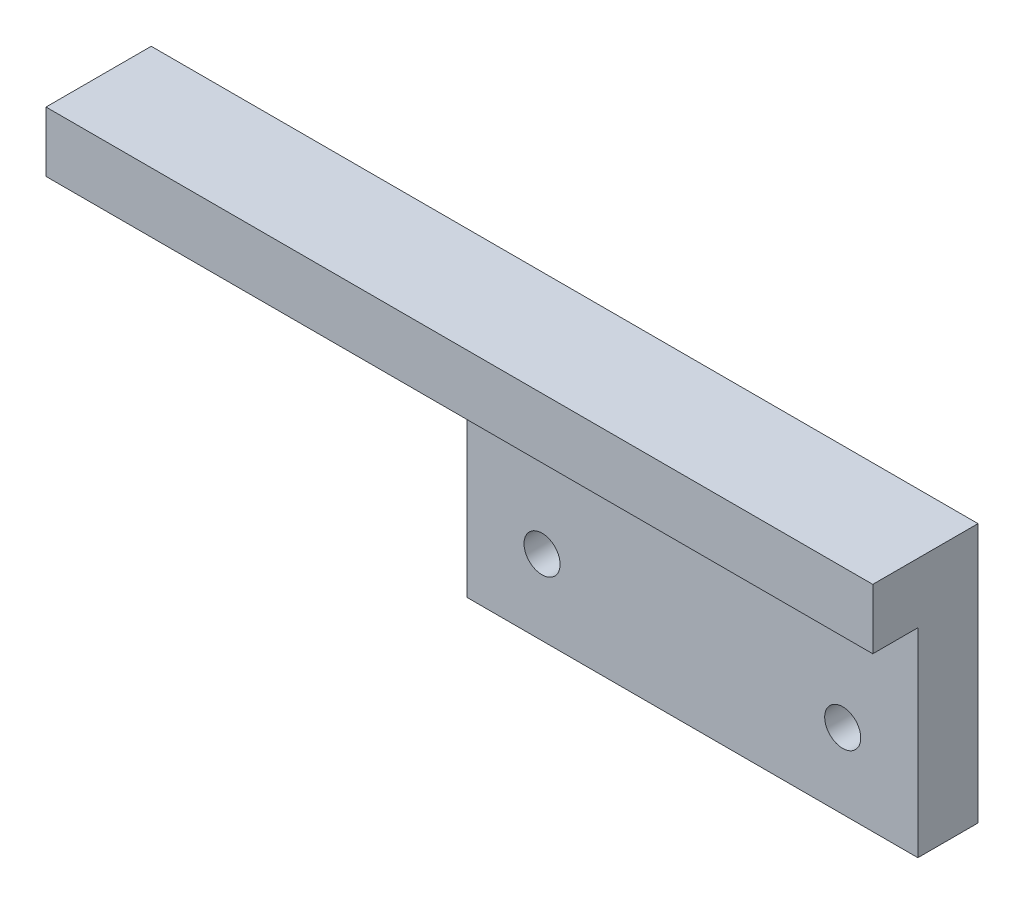
ISO-10303-21;
HEADER;
FILE_DESCRIPTION(('STEP AP214'),'2;1');
FILE_NAME('part.step','',(''),(''),'','','');
FILE_SCHEMA(('AUTOMOTIVE_DESIGN { 1 0 10303 214 1 1 1 1 }'));
ENDSEC;
DATA;
#1=APPLICATION_CONTEXT('core data for automotive mechanical design processes');
#2=APPLICATION_PROTOCOL_DEFINITION('international standard','automotive_design',2000,#1);
#3=PRODUCT_CONTEXT('',#1,'mechanical');
#4=PRODUCT('Part','Part','',(#3));
#5=PRODUCT_RELATED_PRODUCT_CATEGORY('part','',(#4));
#6=PRODUCT_DEFINITION_FORMATION('','',#4);
#7=PRODUCT_DEFINITION_CONTEXT('part definition',#1,'design');
#8=PRODUCT_DEFINITION('design','',#6,#7);
#9=PRODUCT_DEFINITION_SHAPE('','',#8);
#10=(LENGTH_UNIT() NAMED_UNIT(*) SI_UNIT(.MILLI.,.METRE.));
#11=(NAMED_UNIT(*) PLANE_ANGLE_UNIT() SI_UNIT($,.RADIAN.));
#12=(NAMED_UNIT(*) SI_UNIT($,.STERADIAN.) SOLID_ANGLE_UNIT());
#13=UNCERTAINTY_MEASURE_WITH_UNIT(LENGTH_MEASURE(1.E-05),#10,'distance_accuracy_value','');
#14=(GEOMETRIC_REPRESENTATION_CONTEXT(3) GLOBAL_UNCERTAINTY_ASSIGNED_CONTEXT((#13)) GLOBAL_UNIT_ASSIGNED_CONTEXT((#10,
#11,#12)) REPRESENTATION_CONTEXT('',''));
#15=CARTESIAN_POINT('',(0.,0.,0.));
#16=DIRECTION('',(0.,0.,1.));
#17=DIRECTION('',(1.,0.,0.));
#18=AXIS2_PLACEMENT_3D('',#15,#16,#17);
#19=CARTESIAN_POINT('',(-30.,13.25,8.));
#20=DIRECTION('',(1.,0.,0.));
#21=DIRECTION('',(0.,1.,0.));
#22=AXIS2_PLACEMENT_3D('',#19,#20,#21);
#23=PLANE('',#22);
#24=DIRECTION('',(0.,0.,1.));
#25=VECTOR('',#24,1.);
#26=CARTESIAN_POINT('',(-30.,13.25,0.));
#27=LINE('',#26,#25);
#28=CARTESIAN_POINT('',(-30.,13.25,0.));
#29=VERTEX_POINT('',#28);
#30=CARTESIAN_POINT('',(-30.,13.25,8.));
#31=VERTEX_POINT('',#30);
#32=EDGE_CURVE('E91',#29,#31,#27,.T.);
#33=ORIENTED_EDGE('',*,*,#32,.F.);
#34=DIRECTION('',(0.,-1.,0.));
#35=VECTOR('',#34,1.);
#36=CARTESIAN_POINT('',(-30.,13.25,0.));
#37=LINE('',#36,#35);
#38=CARTESIAN_POINT('',(-30.,-13.25,0.));
#39=VERTEX_POINT('',#38);
#40=EDGE_CURVE('E75',#29,#39,#37,.T.);
#41=ORIENTED_EDGE('',*,*,#40,.T.);
#42=DIRECTION('',(0.,0.,-1.));
#43=VECTOR('',#42,1.);
#44=CARTESIAN_POINT('',(-30.,-13.25,8.));
#45=LINE('',#44,#43);
#46=CARTESIAN_POINT('',(-30.,-13.25,8.));
#47=VERTEX_POINT('',#46);
#48=EDGE_CURVE('E11',#47,#39,#45,.T.);
#49=ORIENTED_EDGE('',*,*,#48,.F.);
#50=DIRECTION('',(0.,-1.,0.));
#51=VECTOR('',#50,1.);
#52=CARTESIAN_POINT('',(-30.,13.25,8.));
#53=LINE('',#52,#51);
#54=EDGE_CURVE('E102',#31,#47,#53,.T.);
#55=ORIENTED_EDGE('',*,*,#54,.F.);
#56=EDGE_LOOP('',(#33,#41,#49,#55));
#57=FACE_BOUND('',#56,.T.);
#58=ADVANCED_FACE('F43',(#57),#23,.F.);
#59=CARTESIAN_POINT('',(0.,0.,0.));
#60=DIRECTION('',(0.,0.,1.));
#61=DIRECTION('',(1.,0.,0.));
#62=AXIS2_PLACEMENT_3D('',#59,#60,#61);
#63=PLANE('',#62);
#64=CARTESIAN_POINT('',(-20.,-3.25,0.));
#65=DIRECTION('',(0.,0.,-1.));
#66=DIRECTION('',(-1.,0.,0.));
#67=AXIS2_PLACEMENT_3D('',#64,#65,#66);
#68=CIRCLE('',#67,3.99999999999999);
#69=CARTESIAN_POINT('',(-24.,-3.25,0.));
#70=VERTEX_POINT('',#69);
#71=EDGE_CURVE('E144',#70,#70,#68,.T.);
#72=ORIENTED_EDGE('',*,*,#71,.F.);
#73=EDGE_LOOP('',(#72));
#74=FACE_BOUND('',#73,.T.);
#75=DIRECTION('',(0.,1.,0.));
#76=VECTOR('',#75,1.);
#77=CARTESIAN_POINT('',(30.,13.25,0.));
#78=LINE('',#77,#76);
#79=CARTESIAN_POINT('',(30.,-13.25,0.));
#80=VERTEX_POINT('',#79);
#81=CARTESIAN_POINT('',(30.,21.25,0.));
#82=VERTEX_POINT('',#81);
#83=EDGE_CURVE('E113',#80,#82,#78,.T.);
#84=ORIENTED_EDGE('',*,*,#83,.F.);
#85=DIRECTION('',(1.,0.,0.));
#86=VECTOR('',#85,1.);
#87=CARTESIAN_POINT('',(-30.,-13.25,0.));
#88=LINE('',#87,#86);
#89=EDGE_CURVE('E120',#39,#80,#88,.T.);
#90=ORIENTED_EDGE('',*,*,#89,.F.);
#91=ORIENTED_EDGE('',*,*,#40,.F.);
#92=DIRECTION('',(1.,0.,0.));
#93=VECTOR('',#92,1.);
#94=CARTESIAN_POINT('',(-80.,13.25,0.));
#95=LINE('',#94,#93);
#96=CARTESIAN_POINT('',(-80.,13.25,0.));
#97=VERTEX_POINT('',#96);
#98=EDGE_CURVE('E96',#97,#29,#95,.T.);
#99=ORIENTED_EDGE('',*,*,#98,.F.);
#100=DIRECTION('',(0.,-1.,0.));
#101=VECTOR('',#100,1.);
#102=CARTESIAN_POINT('',(-80.,21.25,0.));
#103=LINE('',#102,#101);
#104=CARTESIAN_POINT('',(-80.,21.25,0.));
#105=VERTEX_POINT('',#104);
#106=EDGE_CURVE('E99',#105,#97,#103,.T.);
#107=ORIENTED_EDGE('',*,*,#106,.F.);
#108=DIRECTION('',(-1.,0.,0.));
#109=VECTOR('',#108,1.);
#110=CARTESIAN_POINT('',(-30.,21.25,0.));
#111=LINE('',#110,#109);
#112=EDGE_CURVE('E128',#82,#105,#111,.T.);
#113=ORIENTED_EDGE('',*,*,#112,.F.);
#114=EDGE_LOOP('',(#84,#90,#91,#99,#107,#113));
#115=FACE_BOUND('',#114,.T.);
#116=CARTESIAN_POINT('',(20.,-3.25,0.));
#117=DIRECTION('',(0.,0.,-1.));
#118=DIRECTION('',(-1.,0.,0.));
#119=AXIS2_PLACEMENT_3D('',#116,#117,#118);
#120=CIRCLE('',#119,3.99999999999999);
#121=CARTESIAN_POINT('',(16.,-3.25,0.));
#122=VERTEX_POINT('',#121);
#123=EDGE_CURVE('E203',#122,#122,#120,.T.);
#124=ORIENTED_EDGE('',*,*,#123,.F.);
#125=EDGE_LOOP('',(#124));
#126=FACE_BOUND('',#125,.T.);
#127=ADVANCED_FACE('F199',(#74,#115,#126),#63,.F.);
#128=CARTESIAN_POINT('',(30.,13.25,8.));
#129=DIRECTION('',(-1.,0.,0.));
#130=DIRECTION('',(0.,-1.,0.));
#131=AXIS2_PLACEMENT_3D('',#128,#129,#130);
#132=PLANE('',#131);
#133=ORIENTED_EDGE('',*,*,#83,.T.);
#134=DIRECTION('',(0.,0.,-1.));
#135=VECTOR('',#134,1.);
#136=CARTESIAN_POINT('',(30.,21.25,14.));
#137=LINE('',#136,#135);
#138=CARTESIAN_POINT('',(30.,21.25,14.));
#139=VERTEX_POINT('',#138);
#140=EDGE_CURVE('E158',#139,#82,#137,.T.);
#141=ORIENTED_EDGE('',*,*,#140,.F.);
#142=DIRECTION('',(0.,1.,0.));
#143=VECTOR('',#142,1.);
#144=CARTESIAN_POINT('',(30.,13.25,14.));
#145=LINE('',#144,#143);
#146=CARTESIAN_POINT('',(30.,13.25,14.));
#147=VERTEX_POINT('',#146);
#148=EDGE_CURVE('E151',#147,#139,#145,.T.);
#149=ORIENTED_EDGE('',*,*,#148,.F.);
#150=DIRECTION('',(0.,0.,-1.));
#151=VECTOR('',#150,1.);
#152=CARTESIAN_POINT('',(30.,13.25,14.));
#153=LINE('',#152,#151);
#154=CARTESIAN_POINT('',(30.,13.25,8.));
#155=VERTEX_POINT('',#154);
#156=EDGE_CURVE('E117',#147,#155,#153,.T.);
#157=ORIENTED_EDGE('',*,*,#156,.T.);
#158=DIRECTION('',(0.,1.,0.));
#159=VECTOR('',#158,1.);
#160=CARTESIAN_POINT('',(30.,13.25,8.));
#161=LINE('',#160,#159);
#162=CARTESIAN_POINT('',(30.,-13.25,8.));
#163=VERTEX_POINT('',#162);
#164=EDGE_CURVE('E104',#163,#155,#161,.T.);
#165=ORIENTED_EDGE('',*,*,#164,.F.);
#166=DIRECTION('',(0.,0.,-1.));
#167=VECTOR('',#166,1.);
#168=CARTESIAN_POINT('',(30.,-13.25,8.));
#169=LINE('',#168,#167);
#170=EDGE_CURVE('E54',#163,#80,#169,.T.);
#171=ORIENTED_EDGE('',*,*,#170,.T.);
#172=EDGE_LOOP('',(#133,#141,#149,#157,#165,#171));
#173=FACE_BOUND('',#172,.T.);
#174=ADVANCED_FACE('F45',(#173),#132,.F.);
#175=CARTESIAN_POINT('',(-30.,-13.25,8.));
#176=DIRECTION('',(0.,1.,0.));
#177=DIRECTION('',(0.,0.,1.));
#178=AXIS2_PLACEMENT_3D('',#175,#176,#177);
#179=PLANE('',#178);
#180=ORIENTED_EDGE('',*,*,#89,.T.);
#181=ORIENTED_EDGE('',*,*,#170,.F.);
#182=DIRECTION('',(1.,0.,0.));
#183=VECTOR('',#182,1.);
#184=CARTESIAN_POINT('',(-30.,-13.25,8.));
#185=LINE('',#184,#183);
#186=EDGE_CURVE('E63',#47,#163,#185,.T.);
#187=ORIENTED_EDGE('',*,*,#186,.F.);
#188=ORIENTED_EDGE('',*,*,#48,.T.);
#189=EDGE_LOOP('',(#180,#181,#187,#188));
#190=FACE_BOUND('',#189,.T.);
#191=ADVANCED_FACE('F231',(#190),#179,.F.);
#192=CARTESIAN_POINT('',(0.,0.,8.));
#193=DIRECTION('',(0.,0.,1.));
#194=DIRECTION('',(1.,0.,0.));
#195=AXIS2_PLACEMENT_3D('',#192,#193,#194);
#196=PLANE('',#195);
#197=CARTESIAN_POINT('',(20.,-3.25,8.));
#198=DIRECTION('',(0.,0.,1.));
#199=DIRECTION('',(1.,0.,0.));
#200=AXIS2_PLACEMENT_3D('',#197,#198,#199);
#201=CIRCLE('',#200,2.4);
#202=CARTESIAN_POINT('',(22.4,-3.25,8.));
#203=VERTEX_POINT('',#202);
#204=EDGE_CURVE('E47',#203,#203,#201,.T.);
#205=ORIENTED_EDGE('',*,*,#204,.F.);
#206=EDGE_LOOP('',(#205));
#207=FACE_BOUND('',#206,.T.);
#208=CARTESIAN_POINT('',(-20.,-3.25,8.));
#209=DIRECTION('',(0.,0.,1.));
#210=DIRECTION('',(1.,0.,0.));
#211=AXIS2_PLACEMENT_3D('',#208,#209,#210);
#212=CIRCLE('',#211,2.4);
#213=CARTESIAN_POINT('',(-17.6,-3.25,8.));
#214=VERTEX_POINT('',#213);
#215=EDGE_CURVE('E125',#214,#214,#212,.T.);
#216=ORIENTED_EDGE('',*,*,#215,.F.);
#217=EDGE_LOOP('',(#216));
#218=FACE_BOUND('',#217,.T.);
#219=ORIENTED_EDGE('',*,*,#164,.T.);
#220=DIRECTION('',(-1.,0.,0.));
#221=VECTOR('',#220,1.);
#222=CARTESIAN_POINT('',(-30.,13.25,8.));
#223=LINE('',#222,#221);
#224=EDGE_CURVE('E84',#155,#31,#223,.T.);
#225=ORIENTED_EDGE('',*,*,#224,.T.);
#226=ORIENTED_EDGE('',*,*,#54,.T.);
#227=ORIENTED_EDGE('',*,*,#186,.T.);
#228=EDGE_LOOP('',(#219,#225,#226,#227));
#229=FACE_BOUND('',#228,.T.);
#230=ADVANCED_FACE('F101',(#207,#218,#229),#196,.T.);
#231=CARTESIAN_POINT('',(-30.,13.25,14.));
#232=DIRECTION('',(0.,1.,0.));
#233=DIRECTION('',(0.,0.,1.));
#234=AXIS2_PLACEMENT_3D('',#231,#232,#233);
#235=PLANE('',#234);
#236=ORIENTED_EDGE('',*,*,#224,.F.);
#237=ORIENTED_EDGE('',*,*,#156,.F.);
#238=DIRECTION('',(1.,0.,0.));
#239=VECTOR('',#238,1.);
#240=CARTESIAN_POINT('',(-30.,13.25,14.));
#241=LINE('',#240,#239);
#242=CARTESIAN_POINT('',(-80.,13.25,14.));
#243=VERTEX_POINT('',#242);
#244=EDGE_CURVE('E135',#243,#147,#241,.T.);
#245=ORIENTED_EDGE('',*,*,#244,.F.);
#246=DIRECTION('',(0.,0.,1.));
#247=VECTOR('',#246,1.);
#248=CARTESIAN_POINT('',(-80.,13.25,0.));
#249=LINE('',#248,#247);
#250=EDGE_CURVE('E182',#97,#243,#249,.T.);
#251=ORIENTED_EDGE('',*,*,#250,.F.);
#252=ORIENTED_EDGE('',*,*,#98,.T.);
#253=ORIENTED_EDGE('',*,*,#32,.T.);
#254=EDGE_LOOP('',(#236,#237,#245,#251,#252,#253));
#255=FACE_BOUND('',#254,.T.);
#256=ADVANCED_FACE('F92',(#255),#235,.F.);
#257=CARTESIAN_POINT('',(-30.,21.25,14.));
#258=DIRECTION('',(0.,-1.,0.));
#259=DIRECTION('',(0.,0.,-1.));
#260=AXIS2_PLACEMENT_3D('',#257,#258,#259);
#261=PLANE('',#260);
#262=ORIENTED_EDGE('',*,*,#140,.T.);
#263=ORIENTED_EDGE('',*,*,#112,.T.);
#264=DIRECTION('',(0.,0.,-1.));
#265=VECTOR('',#264,1.);
#266=CARTESIAN_POINT('',(-80.,21.25,0.));
#267=LINE('',#266,#265);
#268=CARTESIAN_POINT('',(-80.,21.25,14.));
#269=VERTEX_POINT('',#268);
#270=EDGE_CURVE('E193',#269,#105,#267,.T.);
#271=ORIENTED_EDGE('',*,*,#270,.F.);
#272=DIRECTION('',(-1.,0.,0.));
#273=VECTOR('',#272,1.);
#274=CARTESIAN_POINT('',(-30.,21.25,14.));
#275=LINE('',#274,#273);
#276=EDGE_CURVE('E154',#139,#269,#275,.T.);
#277=ORIENTED_EDGE('',*,*,#276,.F.);
#278=EDGE_LOOP('',(#262,#263,#271,#277));
#279=FACE_BOUND('',#278,.T.);
#280=ADVANCED_FACE('F237',(#279),#261,.F.);
#281=CARTESIAN_POINT('',(0.,0.,14.));
#282=DIRECTION('',(0.,0.,-1.));
#283=DIRECTION('',(-1.,0.,0.));
#284=AXIS2_PLACEMENT_3D('',#281,#282,#283);
#285=PLANE('',#284);
#286=ORIENTED_EDGE('',*,*,#276,.T.);
#287=DIRECTION('',(0.,1.,0.));
#288=VECTOR('',#287,1.);
#289=CARTESIAN_POINT('',(-80.,21.25,14.));
#290=LINE('',#289,#288);
#291=EDGE_CURVE('E187',#243,#269,#290,.T.);
#292=ORIENTED_EDGE('',*,*,#291,.F.);
#293=ORIENTED_EDGE('',*,*,#244,.T.);
#294=ORIENTED_EDGE('',*,*,#148,.T.);
#295=EDGE_LOOP('',(#286,#292,#293,#294));
#296=FACE_BOUND('',#295,.T.);
#297=ADVANCED_FACE('F292',(#296),#285,.F.);
#298=CARTESIAN_POINT('',(-20.,-3.25,0.));
#299=DIRECTION('',(0.,0.,-1.));
#300=DIRECTION('',(-1.,0.,0.));
#301=AXIS2_PLACEMENT_3D('',#298,#299,#300);
#302=CYLINDRICAL_SURFACE('',#301,2.4);
#303=ORIENTED_EDGE('',*,*,#215,.T.);
#304=EDGE_LOOP('',(#303));
#305=FACE_BOUND('',#304,.T.);
#306=CARTESIAN_POINT('',(-20.,-3.25,4.));
#307=DIRECTION('',(0.,0.,-1.));
#308=DIRECTION('',(-1.,0.,0.));
#309=AXIS2_PLACEMENT_3D('',#306,#307,#308);
#310=CIRCLE('',#309,2.4);
#311=CARTESIAN_POINT('',(-22.4,-3.25,4.));
#312=VERTEX_POINT('',#311);
#313=EDGE_CURVE('E129',#312,#312,#310,.T.);
#314=ORIENTED_EDGE('',*,*,#313,.T.);
#315=EDGE_LOOP('',(#314));
#316=FACE_BOUND('',#315,.T.);
#317=ADVANCED_FACE('F305',(#305,#316),#302,.F.);
#318=CARTESIAN_POINT('',(-17.6,-3.25,4.));
#319=DIRECTION('',(0.,0.,1.));
#320=DIRECTION('',(1.,0.,0.));
#321=AXIS2_PLACEMENT_3D('',#318,#319,#320);
#322=PLANE('',#321);
#323=ORIENTED_EDGE('',*,*,#313,.F.);
#324=EDGE_LOOP('',(#323));
#325=FACE_BOUND('',#324,.T.);
#326=CARTESIAN_POINT('',(-20.,-3.25,4.));
#327=DIRECTION('',(0.,0.,-1.));
#328=DIRECTION('',(-1.,0.,0.));
#329=AXIS2_PLACEMENT_3D('',#326,#327,#328);
#330=CIRCLE('',#329,4.);
#331=CARTESIAN_POINT('',(-24.,-3.25,4.));
#332=VERTEX_POINT('',#331);
#333=EDGE_CURVE('E138',#332,#332,#330,.T.);
#334=ORIENTED_EDGE('',*,*,#333,.T.);
#335=EDGE_LOOP('',(#334));
#336=FACE_BOUND('',#335,.T.);
#337=ADVANCED_FACE('F325',(#325,#336),#322,.F.);
#338=CARTESIAN_POINT('',(-20.,-3.25,0.));
#339=DIRECTION('',(0.,0.,-1.));
#340=DIRECTION('',(-1.,0.,0.));
#341=AXIS2_PLACEMENT_3D('',#338,#339,#340);
#342=CYLINDRICAL_SURFACE('',#341,3.99999999999999);
#343=ORIENTED_EDGE('',*,*,#333,.F.);
#344=EDGE_LOOP('',(#343));
#345=FACE_BOUND('',#344,.T.);
#346=ORIENTED_EDGE('',*,*,#71,.T.);
#347=EDGE_LOOP('',(#346));
#348=FACE_BOUND('',#347,.T.);
#349=ADVANCED_FACE('F335',(#345,#348),#342,.F.);
#350=CARTESIAN_POINT('',(20.,-3.25,0.));
#351=DIRECTION('',(0.,0.,-1.));
#352=DIRECTION('',(-1.,0.,0.));
#353=AXIS2_PLACEMENT_3D('',#350,#351,#352);
#354=CYLINDRICAL_SURFACE('',#353,2.4);
#355=ORIENTED_EDGE('',*,*,#204,.T.);
#356=EDGE_LOOP('',(#355));
#357=FACE_BOUND('',#356,.T.);
#358=CARTESIAN_POINT('',(20.,-3.25,4.));
#359=DIRECTION('',(0.,0.,-1.));
#360=DIRECTION('',(-1.,0.,0.));
#361=AXIS2_PLACEMENT_3D('',#358,#359,#360);
#362=CIRCLE('',#361,2.4);
#363=CARTESIAN_POINT('',(17.6,-3.25,4.));
#364=VERTEX_POINT('',#363);
#365=EDGE_CURVE('E215',#364,#364,#362,.T.);
#366=ORIENTED_EDGE('',*,*,#365,.T.);
#367=EDGE_LOOP('',(#366));
#368=FACE_BOUND('',#367,.T.);
#369=ADVANCED_FACE('F226',(#357,#368),#354,.F.);
#370=CARTESIAN_POINT('',(22.4,-3.25,4.));
#371=DIRECTION('',(0.,0.,1.));
#372=DIRECTION('',(1.,0.,0.));
#373=AXIS2_PLACEMENT_3D('',#370,#371,#372);
#374=PLANE('',#373);
#375=ORIENTED_EDGE('',*,*,#365,.F.);
#376=EDGE_LOOP('',(#375));
#377=FACE_BOUND('',#376,.T.);
#378=CARTESIAN_POINT('',(20.,-3.25,4.));
#379=DIRECTION('',(0.,0.,-1.));
#380=DIRECTION('',(-1.,0.,0.));
#381=AXIS2_PLACEMENT_3D('',#378,#379,#380);
#382=CIRCLE('',#381,4.);
#383=CARTESIAN_POINT('',(16.,-3.25,4.));
#384=VERTEX_POINT('',#383);
#385=EDGE_CURVE('E208',#384,#384,#382,.T.);
#386=ORIENTED_EDGE('',*,*,#385,.T.);
#387=EDGE_LOOP('',(#386));
#388=FACE_BOUND('',#387,.T.);
#389=ADVANCED_FACE('F356',(#377,#388),#374,.F.);
#390=CARTESIAN_POINT('',(20.,-3.25,0.));
#391=DIRECTION('',(0.,0.,-1.));
#392=DIRECTION('',(-1.,0.,0.));
#393=AXIS2_PLACEMENT_3D('',#390,#391,#392);
#394=CYLINDRICAL_SURFACE('',#393,3.99999999999999);
#395=ORIENTED_EDGE('',*,*,#385,.F.);
#396=EDGE_LOOP('',(#395));
#397=FACE_BOUND('',#396,.T.);
#398=ORIENTED_EDGE('',*,*,#123,.T.);
#399=EDGE_LOOP('',(#398));
#400=FACE_BOUND('',#399,.T.);
#401=ADVANCED_FACE('F366',(#397,#400),#394,.F.);
#402=CARTESIAN_POINT('',(-80.,0.,0.));
#403=DIRECTION('',(-1.,0.,0.));
#404=DIRECTION('',(0.,0.,1.));
#405=AXIS2_PLACEMENT_3D('',#402,#403,#404);
#406=PLANE('',#405);
#407=ORIENTED_EDGE('',*,*,#106,.T.);
#408=ORIENTED_EDGE('',*,*,#250,.T.);
#409=ORIENTED_EDGE('',*,*,#291,.T.);
#410=ORIENTED_EDGE('',*,*,#270,.T.);
#411=EDGE_LOOP('',(#407,#408,#409,#410));
#412=FACE_BOUND('',#411,.T.);
#413=ADVANCED_FACE('F191',(#412),#406,.T.);
#414=CLOSED_SHELL('',(#58,#127,#174,#191,#230,#256,#280,#297,#317,#337,#349,#369,#389,#401,#413));
#415=MANIFOLD_SOLID_BREP('B2',#414);
#416=ADVANCED_BREP_SHAPE_REPRESENTATION('',(#18,#415),#14);
#417=SHAPE_DEFINITION_REPRESENTATION(#9,#416);
ENDSEC;
END-ISO-10303-21;
